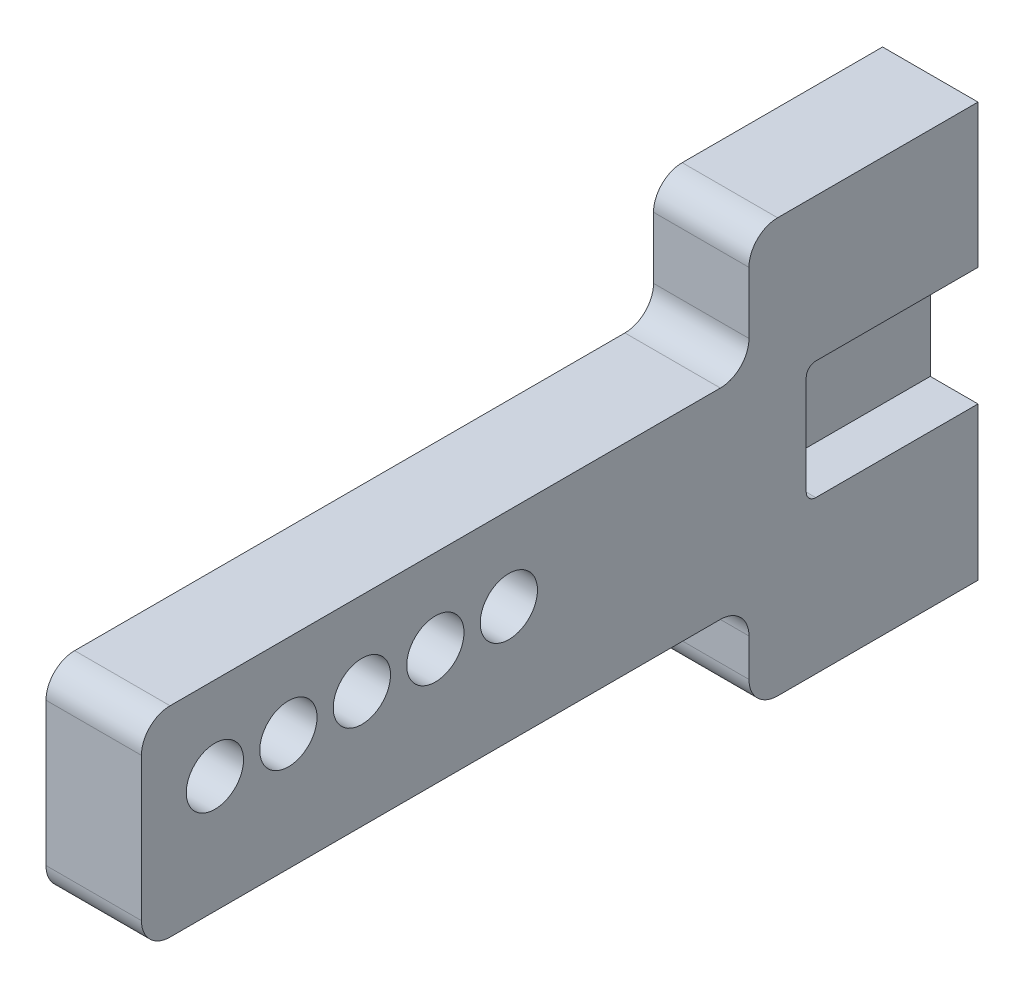
ISO-10303-21;
HEADER;
FILE_DESCRIPTION(('STEP AP214'),'2;1');
FILE_NAME('part.step','',(''),(''),'','','');
FILE_SCHEMA(('AUTOMOTIVE_DESIGN { 1 0 10303 214 1 1 1 1 }'));
ENDSEC;
DATA;
#1=APPLICATION_CONTEXT('core data for automotive mechanical design processes');
#2=APPLICATION_PROTOCOL_DEFINITION('international standard','automotive_design',2000,#1);
#3=PRODUCT_CONTEXT('',#1,'mechanical');
#4=PRODUCT('Part','Part','',(#3));
#5=PRODUCT_RELATED_PRODUCT_CATEGORY('part','',(#4));
#6=PRODUCT_DEFINITION_FORMATION('','',#4);
#7=PRODUCT_DEFINITION_CONTEXT('part definition',#1,'design');
#8=PRODUCT_DEFINITION('design','',#6,#7);
#9=PRODUCT_DEFINITION_SHAPE('','',#8);
#10=(LENGTH_UNIT() NAMED_UNIT(*) SI_UNIT(.MILLI.,.METRE.));
#11=(NAMED_UNIT(*) PLANE_ANGLE_UNIT() SI_UNIT($,.RADIAN.));
#12=(NAMED_UNIT(*) SI_UNIT($,.STERADIAN.) SOLID_ANGLE_UNIT());
#13=UNCERTAINTY_MEASURE_WITH_UNIT(LENGTH_MEASURE(1.E-05),#10,'distance_accuracy_value','');
#14=(GEOMETRIC_REPRESENTATION_CONTEXT(3) GLOBAL_UNCERTAINTY_ASSIGNED_CONTEXT((#13)) GLOBAL_UNIT_ASSIGNED_CONTEXT((#10,
#11,#12)) REPRESENTATION_CONTEXT('',''));
#15=CARTESIAN_POINT('',(0.,0.,0.));
#16=DIRECTION('',(0.,0.,1.));
#17=DIRECTION('',(1.,0.,0.));
#18=AXIS2_PLACEMENT_3D('',#15,#16,#17);
#19=CARTESIAN_POINT('',(10.,-10.2165086349905,0.));
#20=DIRECTION('',(0.,0.,1.));
#21=DIRECTION('',(1.,0.,0.));
#22=AXIS2_PLACEMENT_3D('',#19,#20,#21);
#23=PLANE('',#22);
#24=DIRECTION('',(0.,1.,0.));
#25=VECTOR('',#24,1.);
#26=CARTESIAN_POINT('',(5.,12.394708994709,0.));
#27=LINE('',#26,#25);
#28=CARTESIAN_POINT('',(5.,0.,0.));
#29=VERTEX_POINT('',#28);
#30=CARTESIAN_POINT('',(5.,12.394708994709,0.));
#31=VERTEX_POINT('',#30);
#32=EDGE_CURVE('E190',#29,#31,#27,.T.);
#33=ORIENTED_EDGE('',*,*,#32,.F.);
#34=DIRECTION('',(1.,0.,0.));
#35=VECTOR('',#34,1.);
#36=CARTESIAN_POINT('',(5.,0.,0.));
#37=LINE('',#36,#35);
#38=CARTESIAN_POINT('',(10.,0.,0.));
#39=VERTEX_POINT('',#38);
#40=EDGE_CURVE('E207',#29,#39,#37,.T.);
#41=ORIENTED_EDGE('',*,*,#40,.T.);
#42=DIRECTION('',(0.,1.,0.));
#43=VECTOR('',#42,1.);
#44=CARTESIAN_POINT('',(10.,-16.0028498087904,0.));
#45=LINE('',#44,#43);
#46=CARTESIAN_POINT('',(10.,-16.0028498087904,0.));
#47=VERTEX_POINT('',#46);
#48=EDGE_CURVE('E216',#47,#39,#45,.T.);
#49=ORIENTED_EDGE('',*,*,#48,.F.);
#50=DIRECTION('',(-1.,0.,0.));
#51=VECTOR('',#50,1.);
#52=CARTESIAN_POINT('',(10.,-16.0028498087904,0.));
#53=LINE('',#52,#51);
#54=CARTESIAN_POINT('',(0.,-16.0028498087904,0.));
#55=VERTEX_POINT('',#54);
#56=EDGE_CURVE('E245',#47,#55,#53,.T.);
#57=ORIENTED_EDGE('',*,*,#56,.T.);
#58=DIRECTION('',(0.,1.,0.));
#59=VECTOR('',#58,1.);
#60=CARTESIAN_POINT('',(0.,-10.2165086349905,0.));
#61=LINE('',#60,#59);
#62=CARTESIAN_POINT('',(0.,27.394708994709,0.));
#63=VERTEX_POINT('',#62);
#64=EDGE_CURVE('E211',#55,#63,#61,.T.);
#65=ORIENTED_EDGE('',*,*,#64,.T.);
#66=DIRECTION('',(-1.,0.,0.));
#67=VECTOR('',#66,1.);
#68=CARTESIAN_POINT('',(10.,27.394708994709,0.));
#69=LINE('',#68,#67);
#70=CARTESIAN_POINT('',(10.,27.394708994709,0.));
#71=VERTEX_POINT('',#70);
#72=EDGE_CURVE('E276',#71,#63,#69,.T.);
#73=ORIENTED_EDGE('',*,*,#72,.F.);
#74=CARTESIAN_POINT('',(10.,12.394708994709,0.));
#75=VERTEX_POINT('',#74);
#76=EDGE_CURVE('E205',#75,#71,#45,.T.);
#77=ORIENTED_EDGE('',*,*,#76,.F.);
#78=DIRECTION('',(1.,0.,0.));
#79=VECTOR('',#78,1.);
#80=CARTESIAN_POINT('',(5.,12.394708994709,0.));
#81=LINE('',#80,#79);
#82=EDGE_CURVE('E185',#31,#75,#81,.T.);
#83=ORIENTED_EDGE('',*,*,#82,.F.);
#84=EDGE_LOOP('',(#33,#41,#49,#57,#65,#73,#77,#83));
#85=FACE_BOUND('',#84,.T.);
#86=ADVANCED_FACE('F45',(#85),#23,.F.);
#87=CARTESIAN_POINT('',(10.,27.394708994709,0.));
#88=DIRECTION('',(0.,-1.,0.));
#89=DIRECTION('',(0.,0.,-1.));
#90=AXIS2_PLACEMENT_3D('',#87,#88,#89);
#91=PLANE('',#90);
#92=DIRECTION('',(0.,0.,1.));
#93=VECTOR('',#92,1.);
#94=CARTESIAN_POINT('',(0.,27.394708994709,0.));
#95=LINE('',#94,#93);
#96=CARTESIAN_POINT('',(0.,27.394708994709,21.));
#97=VERTEX_POINT('',#96);
#98=EDGE_CURVE('E248',#63,#97,#95,.T.);
#99=ORIENTED_EDGE('',*,*,#98,.T.);
#100=DIRECTION('',(-1.,0.,0.));
#101=VECTOR('',#100,1.);
#102=CARTESIAN_POINT('',(10.,27.394708994709,21.));
#103=LINE('',#102,#101);
#104=CARTESIAN_POINT('',(10.,27.394708994709,21.));
#105=VERTEX_POINT('',#104);
#106=EDGE_CURVE('E345',#97,#105,#103,.F.);
#107=ORIENTED_EDGE('',*,*,#106,.T.);
#108=DIRECTION('',(0.,0.,1.));
#109=VECTOR('',#108,1.);
#110=CARTESIAN_POINT('',(10.,27.394708994709,0.));
#111=LINE('',#110,#109);
#112=EDGE_CURVE('E220',#71,#105,#111,.T.);
#113=ORIENTED_EDGE('',*,*,#112,.F.);
#114=ORIENTED_EDGE('',*,*,#72,.T.);
#115=EDGE_LOOP('',(#99,#107,#113,#114));
#116=FACE_BOUND('',#115,.T.);
#117=ADVANCED_FACE('F431',(#116),#91,.F.);
#118=CARTESIAN_POINT('',(10.,27.394708994709,24.));
#119=DIRECTION('',(0.,0.,-1.));
#120=DIRECTION('',(0.,1.,0.));
#121=AXIS2_PLACEMENT_3D('',#118,#119,#120);
#122=PLANE('',#121);
#123=DIRECTION('',(0.,-1.,0.));
#124=VECTOR('',#123,1.);
#125=CARTESIAN_POINT('',(10.,27.394708994709,24.));
#126=LINE('',#125,#124);
#127=CARTESIAN_POINT('',(10.,24.394708994709,24.));
#128=VERTEX_POINT('',#127);
#129=CARTESIAN_POINT('',(10.,17.9424240836782,24.));
#130=VERTEX_POINT('',#129);
#131=EDGE_CURVE('E224',#128,#130,#126,.T.);
#132=ORIENTED_EDGE('',*,*,#131,.F.);
#133=DIRECTION('',(-1.,0.,0.));
#134=VECTOR('',#133,1.);
#135=CARTESIAN_POINT('',(10.,24.394708994709,24.));
#136=LINE('',#135,#134);
#137=CARTESIAN_POINT('',(0.,24.394708994709,24.));
#138=VERTEX_POINT('',#137);
#139=EDGE_CURVE('E341',#128,#138,#136,.T.);
#140=ORIENTED_EDGE('',*,*,#139,.T.);
#141=DIRECTION('',(0.,-1.,0.));
#142=VECTOR('',#141,1.);
#143=CARTESIAN_POINT('',(0.,27.394708994709,24.));
#144=LINE('',#143,#142);
#145=CARTESIAN_POINT('',(0.,17.9424240836782,24.));
#146=VERTEX_POINT('',#145);
#147=EDGE_CURVE('E252',#138,#146,#144,.T.);
#148=ORIENTED_EDGE('',*,*,#147,.T.);
#149=DIRECTION('',(-1.,0.,0.));
#150=VECTOR('',#149,1.);
#151=CARTESIAN_POINT('',(10.,17.9424240836782,24.));
#152=LINE('',#151,#150);
#153=EDGE_CURVE('E292',#146,#130,#152,.F.);
#154=ORIENTED_EDGE('',*,*,#153,.T.);
#155=EDGE_LOOP('',(#132,#140,#148,#154));
#156=FACE_BOUND('',#155,.T.);
#157=ADVANCED_FACE('F441',(#156),#122,.F.);
#158=CARTESIAN_POINT('',(10.,14.9424240836782,24.));
#159=DIRECTION('',(0.,-1.,0.));
#160=DIRECTION('',(0.,0.,-1.));
#161=AXIS2_PLACEMENT_3D('',#158,#159,#160);
#162=PLANE('',#161);
#163=DIRECTION('',(0.,0.,1.));
#164=VECTOR('',#163,1.);
#165=CARTESIAN_POINT('',(0.,14.9424240836782,24.));
#166=LINE('',#165,#164);
#167=CARTESIAN_POINT('',(0.,14.9424240836782,27.));
#168=VERTEX_POINT('',#167);
#169=CARTESIAN_POINT('',(0.,14.9424240836782,84.6638189462944));
#170=VERTEX_POINT('',#169);
#171=EDGE_CURVE('E255',#168,#170,#166,.T.);
#172=ORIENTED_EDGE('',*,*,#171,.T.);
#173=DIRECTION('',(-1.,0.,0.));
#174=VECTOR('',#173,1.);
#175=CARTESIAN_POINT('',(10.,14.9424240836782,84.6638189462944));
#176=LINE('',#175,#174);
#177=CARTESIAN_POINT('',(10.,14.9424240836782,84.6638189462944));
#178=VERTEX_POINT('',#177);
#179=EDGE_CURVE('E359',#170,#178,#176,.F.);
#180=ORIENTED_EDGE('',*,*,#179,.T.);
#181=DIRECTION('',(0.,0.,1.));
#182=VECTOR('',#181,1.);
#183=CARTESIAN_POINT('',(10.,14.9424240836782,24.));
#184=LINE('',#183,#182);
#185=CARTESIAN_POINT('',(10.,14.9424240836782,27.));
#186=VERTEX_POINT('',#185);
#187=EDGE_CURVE('E227',#186,#178,#184,.T.);
#188=ORIENTED_EDGE('',*,*,#187,.F.);
#189=DIRECTION('',(-1.,0.,0.));
#190=VECTOR('',#189,1.);
#191=CARTESIAN_POINT('',(0.,14.9424240836782,27.));
#192=LINE('',#191,#190);
#193=EDGE_CURVE('E288',#186,#168,#192,.T.);
#194=ORIENTED_EDGE('',*,*,#193,.T.);
#195=EDGE_LOOP('',(#172,#180,#188,#194));
#196=FACE_BOUND('',#195,.T.);
#197=ADVANCED_FACE('F450',(#196),#162,.F.);
#198=CARTESIAN_POINT('',(10.,14.9424240836782,87.6638189462944));
#199=DIRECTION('',(0.,0.,-1.));
#200=DIRECTION('',(-1.,0.,0.));
#201=AXIS2_PLACEMENT_3D('',#198,#199,#200);
#202=PLANE('',#201);
#203=DIRECTION('',(0.,-1.,0.));
#204=VECTOR('',#203,1.);
#205=CARTESIAN_POINT('',(0.,14.9424240836782,87.6638189462944));
#206=LINE('',#205,#204);
#207=CARTESIAN_POINT('',(0.,11.9424240836782,87.6638189462944));
#208=VERTEX_POINT('',#207);
#209=CARTESIAN_POINT('',(0.,-3.05757591632179,87.6638189462944));
#210=VERTEX_POINT('',#209);
#211=EDGE_CURVE('E259',#208,#210,#206,.T.);
#212=ORIENTED_EDGE('',*,*,#211,.T.);
#213=DIRECTION('',(-1.,0.,0.));
#214=VECTOR('',#213,1.);
#215=CARTESIAN_POINT('',(10.,-3.05757591632179,87.6638189462944));
#216=LINE('',#215,#214);
#217=CARTESIAN_POINT('',(10.,-3.05757591632179,87.6638189462944));
#218=VERTEX_POINT('',#217);
#219=EDGE_CURVE('E356',#210,#218,#216,.F.);
#220=ORIENTED_EDGE('',*,*,#219,.T.);
#221=DIRECTION('',(0.,-1.,0.));
#222=VECTOR('',#221,1.);
#223=CARTESIAN_POINT('',(10.,14.9424240836782,87.6638189462944));
#224=LINE('',#223,#222);
#225=CARTESIAN_POINT('',(10.,11.9424240836782,87.6638189462944));
#226=VERTEX_POINT('',#225);
#227=EDGE_CURVE('E231',#226,#218,#224,.T.);
#228=ORIENTED_EDGE('',*,*,#227,.F.);
#229=DIRECTION('',(-1.,0.,0.));
#230=VECTOR('',#229,1.);
#231=CARTESIAN_POINT('',(10.,11.9424240836782,87.6638189462944));
#232=LINE('',#231,#230);
#233=EDGE_CURVE('E352',#226,#208,#232,.T.);
#234=ORIENTED_EDGE('',*,*,#233,.T.);
#235=EDGE_LOOP('',(#212,#220,#228,#234));
#236=FACE_BOUND('',#235,.T.);
#237=ADVANCED_FACE('F461',(#236),#202,.F.);
#238=CARTESIAN_POINT('',(10.,-6.0575759163218,87.6638189462944));
#239=DIRECTION('',(0.,1.,0.));
#240=DIRECTION('',(0.,0.,1.));
#241=AXIS2_PLACEMENT_3D('',#238,#239,#240);
#242=PLANE('',#241);
#243=DIRECTION('',(0.,0.,-1.));
#244=VECTOR('',#243,1.);
#245=CARTESIAN_POINT('',(10.,-6.0575759163218,87.6638189462944));
#246=LINE('',#245,#244);
#247=CARTESIAN_POINT('',(10.,-6.0575759163218,84.6638189462944));
#248=VERTEX_POINT('',#247);
#249=CARTESIAN_POINT('',(10.,-6.0575759163218,27.));
#250=VERTEX_POINT('',#249);
#251=EDGE_CURVE('E235',#248,#250,#246,.T.);
#252=ORIENTED_EDGE('',*,*,#251,.F.);
#253=DIRECTION('',(-1.,0.,0.));
#254=VECTOR('',#253,1.);
#255=CARTESIAN_POINT('',(10.,-6.0575759163218,84.6638189462944));
#256=LINE('',#255,#254);
#257=CARTESIAN_POINT('',(0.,-6.0575759163218,84.6638189462944));
#258=VERTEX_POINT('',#257);
#259=EDGE_CURVE('E348',#248,#258,#256,.T.);
#260=ORIENTED_EDGE('',*,*,#259,.T.);
#261=DIRECTION('',(0.,0.,-1.));
#262=VECTOR('',#261,1.);
#263=CARTESIAN_POINT('',(0.,-6.0575759163218,87.6638189462944));
#264=LINE('',#263,#262);
#265=CARTESIAN_POINT('',(0.,-6.0575759163218,27.));
#266=VERTEX_POINT('',#265);
#267=EDGE_CURVE('E263',#258,#266,#264,.T.);
#268=ORIENTED_EDGE('',*,*,#267,.T.);
#269=DIRECTION('',(-1.,0.,0.));
#270=VECTOR('',#269,1.);
#271=CARTESIAN_POINT('',(10.,-6.0575759163218,27.));
#272=LINE('',#271,#270);
#273=EDGE_CURVE('E284',#266,#250,#272,.F.);
#274=ORIENTED_EDGE('',*,*,#273,.T.);
#275=EDGE_LOOP('',(#252,#260,#268,#274));
#276=FACE_BOUND('',#275,.T.);
#277=ADVANCED_FACE('F468',(#276),#242,.F.);
#278=CARTESIAN_POINT('',(10.,-6.0575759163218,24.));
#279=DIRECTION('',(0.,0.,-1.));
#280=DIRECTION('',(0.,1.,0.));
#281=AXIS2_PLACEMENT_3D('',#278,#279,#280);
#282=PLANE('',#281);
#283=DIRECTION('',(0.,-1.,0.));
#284=VECTOR('',#283,1.);
#285=CARTESIAN_POINT('',(0.,-6.0575759163218,24.));
#286=LINE('',#285,#284);
#287=CARTESIAN_POINT('',(0.,-9.05757591632179,24.));
#288=VERTEX_POINT('',#287);
#289=CARTESIAN_POINT('',(0.,-13.0028498087904,24.));
#290=VERTEX_POINT('',#289);
#291=EDGE_CURVE('E266',#288,#290,#286,.T.);
#292=ORIENTED_EDGE('',*,*,#291,.T.);
#293=DIRECTION('',(-1.,0.,0.));
#294=VECTOR('',#293,1.);
#295=CARTESIAN_POINT('',(10.,-13.0028498087904,24.));
#296=LINE('',#295,#294);
#297=CARTESIAN_POINT('',(10.,-13.0028498087904,24.));
#298=VERTEX_POINT('',#297);
#299=EDGE_CURVE('E326',#290,#298,#296,.F.);
#300=ORIENTED_EDGE('',*,*,#299,.T.);
#301=DIRECTION('',(0.,-1.,0.));
#302=VECTOR('',#301,1.);
#303=CARTESIAN_POINT('',(10.,-6.0575759163218,24.));
#304=LINE('',#303,#302);
#305=CARTESIAN_POINT('',(10.,-9.05757591632179,24.));
#306=VERTEX_POINT('',#305);
#307=EDGE_CURVE('E238',#306,#298,#304,.T.);
#308=ORIENTED_EDGE('',*,*,#307,.F.);
#309=DIRECTION('',(-1.,0.,0.));
#310=VECTOR('',#309,1.);
#311=CARTESIAN_POINT('',(0.,-9.05757591632179,24.));
#312=LINE('',#311,#310);
#313=EDGE_CURVE('E280',#306,#288,#312,.T.);
#314=ORIENTED_EDGE('',*,*,#313,.T.);
#315=EDGE_LOOP('',(#292,#300,#308,#314));
#316=FACE_BOUND('',#315,.T.);
#317=ADVANCED_FACE('F477',(#316),#282,.F.);
#318=CARTESIAN_POINT('',(10.,-16.0028498087904,24.));
#319=DIRECTION('',(0.,1.,0.));
#320=DIRECTION('',(0.,0.,1.));
#321=AXIS2_PLACEMENT_3D('',#318,#319,#320);
#322=PLANE('',#321);
#323=DIRECTION('',(0.,0.,-1.));
#324=VECTOR('',#323,1.);
#325=CARTESIAN_POINT('',(10.,-16.0028498087904,24.));
#326=LINE('',#325,#324);
#327=CARTESIAN_POINT('',(10.,-16.0028498087904,21.));
#328=VERTEX_POINT('',#327);
#329=EDGE_CURVE('E242',#328,#47,#326,.T.);
#330=ORIENTED_EDGE('',*,*,#329,.F.);
#331=DIRECTION('',(-1.,0.,0.));
#332=VECTOR('',#331,1.);
#333=CARTESIAN_POINT('',(10.,-16.0028498087904,21.));
#334=LINE('',#333,#332);
#335=CARTESIAN_POINT('',(0.,-16.0028498087904,21.));
#336=VERTEX_POINT('',#335);
#337=EDGE_CURVE('E310',#328,#336,#334,.T.);
#338=ORIENTED_EDGE('',*,*,#337,.T.);
#339=DIRECTION('',(0.,0.,-1.));
#340=VECTOR('',#339,1.);
#341=CARTESIAN_POINT('',(0.,-16.0028498087904,24.));
#342=LINE('',#341,#340);
#343=EDGE_CURVE('E270',#336,#55,#342,.T.);
#344=ORIENTED_EDGE('',*,*,#343,.T.);
#345=ORIENTED_EDGE('',*,*,#56,.F.);
#346=EDGE_LOOP('',(#330,#338,#344,#345));
#347=FACE_BOUND('',#346,.T.);
#348=ADVANCED_FACE('F424',(#347),#322,.F.);
#349=CARTESIAN_POINT('',(10.,0.,0.));
#350=DIRECTION('',(1.,0.,0.));
#351=DIRECTION('',(0.,0.,-1.));
#352=AXIS2_PLACEMENT_3D('',#349,#350,#351);
#353=PLANE('',#352);
#354=CARTESIAN_POINT('',(10.,6.19735449735449,79.9638189462944));
#355=DIRECTION('',(1.,0.,0.));
#356=DIRECTION('',(0.,0.,-1.));
#357=AXIS2_PLACEMENT_3D('',#354,#355,#356);
#358=CIRCLE('',#357,3.00000000000001);
#359=CARTESIAN_POINT('',(10.,6.19735449735449,76.9638189462944));
#360=VERTEX_POINT('',#359);
#361=EDGE_CURVE('E388',#360,#360,#358,.T.);
#362=ORIENTED_EDGE('',*,*,#361,.F.);
#363=EDGE_LOOP('',(#362));
#364=FACE_BOUND('',#363,.T.);
#365=CARTESIAN_POINT('',(10.,6.19735449735449,72.2638189462944));
#366=DIRECTION('',(1.,0.,0.));
#367=DIRECTION('',(0.,0.,-1.));
#368=AXIS2_PLACEMENT_3D('',#365,#366,#367);
#369=CIRCLE('',#368,3.00000000000001);
#370=CARTESIAN_POINT('',(10.,6.19735449735449,69.2638189462944));
#371=VERTEX_POINT('',#370);
#372=EDGE_CURVE('E703',#371,#371,#369,.T.);
#373=ORIENTED_EDGE('',*,*,#372,.F.);
#374=EDGE_LOOP('',(#373));
#375=FACE_BOUND('',#374,.T.);
#376=CARTESIAN_POINT('',(10.,6.19735449735449,64.5638189462944));
#377=DIRECTION('',(1.,0.,0.));
#378=DIRECTION('',(0.,0.,-1.));
#379=AXIS2_PLACEMENT_3D('',#376,#377,#378);
#380=CIRCLE('',#379,3.);
#381=CARTESIAN_POINT('',(10.,6.19735449735449,61.5638189462944));
#382=VERTEX_POINT('',#381);
#383=EDGE_CURVE('E707',#382,#382,#380,.T.);
#384=ORIENTED_EDGE('',*,*,#383,.F.);
#385=EDGE_LOOP('',(#384));
#386=FACE_BOUND('',#385,.T.);
#387=CARTESIAN_POINT('',(10.,6.19735449735449,56.8638189462944));
#388=DIRECTION('',(1.,0.,0.));
#389=DIRECTION('',(0.,0.,-1.));
#390=AXIS2_PLACEMENT_3D('',#387,#388,#389);
#391=CIRCLE('',#390,3.);
#392=CARTESIAN_POINT('',(10.,6.19735449735449,53.8638189462944));
#393=VERTEX_POINT('',#392);
#394=EDGE_CURVE('E713',#393,#393,#391,.T.);
#395=ORIENTED_EDGE('',*,*,#394,.F.);
#396=EDGE_LOOP('',(#395));
#397=FACE_BOUND('',#396,.T.);
#398=CARTESIAN_POINT('',(10.,6.19735449735449,49.1638189462944));
#399=DIRECTION('',(1.,0.,0.));
#400=DIRECTION('',(0.,0.,-1.));
#401=AXIS2_PLACEMENT_3D('',#398,#399,#400);
#402=CIRCLE('',#401,3.);
#403=CARTESIAN_POINT('',(10.,6.19735449735449,46.1638189462944));
#404=VERTEX_POINT('',#403);
#405=EDGE_CURVE('E717',#404,#404,#402,.T.);
#406=ORIENTED_EDGE('',*,*,#405,.F.);
#407=EDGE_LOOP('',(#406));
#408=FACE_BOUND('',#407,.T.);
#409=ORIENTED_EDGE('',*,*,#307,.T.);
#410=CARTESIAN_POINT('',(10.,-13.0028498087904,21.));
#411=DIRECTION('',(1.,0.,0.));
#412=DIRECTION('',(0.,0.,-1.));
#413=AXIS2_PLACEMENT_3D('',#410,#411,#412);
#414=CIRCLE('',#413,3.);
#415=EDGE_CURVE('E338',#298,#328,#414,.T.);
#416=ORIENTED_EDGE('',*,*,#415,.T.);
#417=ORIENTED_EDGE('',*,*,#329,.T.);
#418=ORIENTED_EDGE('',*,*,#48,.T.);
#419=DIRECTION('',(0.,0.,-1.));
#420=VECTOR('',#419,1.);
#421=CARTESIAN_POINT('',(10.,0.,0.));
#422=LINE('',#421,#420);
#423=CARTESIAN_POINT('',(10.,0.,17.));
#424=VERTEX_POINT('',#423);
#425=EDGE_CURVE('E201',#424,#39,#422,.T.);
#426=ORIENTED_EDGE('',*,*,#425,.F.);
#427=CARTESIAN_POINT('',(10.,0.999999999999998,17.));
#428=DIRECTION('',(1.,0.,0.));
#429=DIRECTION('',(0.,0.,-1.));
#430=AXIS2_PLACEMENT_3D('',#427,#428,#429);
#431=CIRCLE('',#430,1.);
#432=CARTESIAN_POINT('',(10.,0.999999999999997,18.));
#433=VERTEX_POINT('',#432);
#434=EDGE_CURVE('E55',#424,#433,#431,.F.);
#435=ORIENTED_EDGE('',*,*,#434,.T.);
#436=DIRECTION('',(0.,-1.,0.));
#437=VECTOR('',#436,1.);
#438=CARTESIAN_POINT('',(10.,0.,18.));
#439=LINE('',#438,#437);
#440=CARTESIAN_POINT('',(10.,11.394708994709,18.));
#441=VERTEX_POINT('',#440);
#442=EDGE_CURVE('E406',#441,#433,#439,.T.);
#443=ORIENTED_EDGE('',*,*,#442,.F.);
#444=CARTESIAN_POINT('',(10.,11.394708994709,17.));
#445=DIRECTION('',(1.,0.,0.));
#446=DIRECTION('',(0.,0.,-1.));
#447=AXIS2_PLACEMENT_3D('',#444,#445,#446);
#448=CIRCLE('',#447,1.);
#449=CARTESIAN_POINT('',(10.,12.394708994709,17.));
#450=VERTEX_POINT('',#449);
#451=EDGE_CURVE('E11',#441,#450,#448,.F.);
#452=ORIENTED_EDGE('',*,*,#451,.T.);
#453=DIRECTION('',(0.,0.,1.));
#454=VECTOR('',#453,1.);
#455=CARTESIAN_POINT('',(10.,12.394708994709,18.));
#456=LINE('',#455,#454);
#457=EDGE_CURVE('E402',#75,#450,#456,.T.);
#458=ORIENTED_EDGE('',*,*,#457,.F.);
#459=ORIENTED_EDGE('',*,*,#76,.T.);
#460=ORIENTED_EDGE('',*,*,#112,.T.);
#461=CARTESIAN_POINT('',(10.,24.394708994709,21.));
#462=DIRECTION('',(1.,0.,0.));
#463=DIRECTION('',(0.,0.,-1.));
#464=AXIS2_PLACEMENT_3D('',#461,#462,#463);
#465=CIRCLE('',#464,3.);
#466=EDGE_CURVE('E335',#105,#128,#465,.T.);
#467=ORIENTED_EDGE('',*,*,#466,.T.);
#468=ORIENTED_EDGE('',*,*,#131,.T.);
#469=CARTESIAN_POINT('',(10.,17.9424240836782,27.));
#470=DIRECTION('',(1.,0.,0.));
#471=DIRECTION('',(0.,0.,-1.));
#472=AXIS2_PLACEMENT_3D('',#469,#470,#471);
#473=CIRCLE('',#472,3.);
#474=EDGE_CURVE('E307',#130,#186,#473,.F.);
#475=ORIENTED_EDGE('',*,*,#474,.T.);
#476=ORIENTED_EDGE('',*,*,#187,.T.);
#477=CARTESIAN_POINT('',(10.,11.9424240836782,84.6638189462944));
#478=DIRECTION('',(1.,0.,0.));
#479=DIRECTION('',(0.,0.,-1.));
#480=AXIS2_PLACEMENT_3D('',#477,#478,#479);
#481=CIRCLE('',#480,3.);
#482=EDGE_CURVE('E329',#178,#226,#481,.T.);
#483=ORIENTED_EDGE('',*,*,#482,.T.);
#484=ORIENTED_EDGE('',*,*,#227,.T.);
#485=CARTESIAN_POINT('',(10.,-3.0575759163218,84.6638189462944));
#486=DIRECTION('',(1.,0.,0.));
#487=DIRECTION('',(0.,0.,-1.));
#488=AXIS2_PLACEMENT_3D('',#485,#486,#487);
#489=CIRCLE('',#488,3.);
#490=EDGE_CURVE('E332',#218,#248,#489,.T.);
#491=ORIENTED_EDGE('',*,*,#490,.T.);
#492=ORIENTED_EDGE('',*,*,#251,.T.);
#493=CARTESIAN_POINT('',(10.,-9.0575759163218,27.));
#494=DIRECTION('',(1.,0.,0.));
#495=DIRECTION('',(0.,0.,-1.));
#496=AXIS2_PLACEMENT_3D('',#493,#494,#495);
#497=CIRCLE('',#496,3.);
#498=EDGE_CURVE('E300',#250,#306,#497,.F.);
#499=ORIENTED_EDGE('',*,*,#498,.T.);
#500=EDGE_LOOP('',(#409,#416,#417,#418,#426,#435,#443,#452,#458,#459,#460,#467,#468,#475,#476,
#483,#484,#491,#492,#499));
#501=FACE_BOUND('',#500,.T.);
#502=ADVANCED_FACE('F418',(#364,#375,#386,#397,#408,#501),#353,.T.);
#503=CARTESIAN_POINT('',(0.,0.,0.));
#504=DIRECTION('',(1.,0.,0.));
#505=DIRECTION('',(0.,0.,-1.));
#506=AXIS2_PLACEMENT_3D('',#503,#504,#505);
#507=PLANE('',#506);
#508=CARTESIAN_POINT('',(0.,6.19735449735449,79.9638189462944));
#509=DIRECTION('',(1.,0.,0.));
#510=DIRECTION('',(0.,0.,-1.));
#511=AXIS2_PLACEMENT_3D('',#508,#509,#510);
#512=CIRCLE('',#511,3.00000000000001);
#513=CARTESIAN_POINT('',(0.,6.19735449735449,76.9638189462944));
#514=VERTEX_POINT('',#513);
#515=EDGE_CURVE('E49',#514,#514,#512,.T.);
#516=ORIENTED_EDGE('',*,*,#515,.T.);
#517=EDGE_LOOP('',(#516));
#518=FACE_BOUND('',#517,.T.);
#519=CARTESIAN_POINT('',(0.,6.19735449735449,72.2638189462944));
#520=DIRECTION('',(1.,0.,0.));
#521=DIRECTION('',(0.,0.,-1.));
#522=AXIS2_PLACEMENT_3D('',#519,#520,#521);
#523=CIRCLE('',#522,3.00000000000001);
#524=CARTESIAN_POINT('',(0.,6.19735449735449,69.2638189462944));
#525=VERTEX_POINT('',#524);
#526=EDGE_CURVE('E395',#525,#525,#523,.T.);
#527=ORIENTED_EDGE('',*,*,#526,.T.);
#528=EDGE_LOOP('',(#527));
#529=FACE_BOUND('',#528,.T.);
#530=CARTESIAN_POINT('',(0.,6.19735449735449,64.5638189462944));
#531=DIRECTION('',(1.,0.,0.));
#532=DIRECTION('',(0.,0.,-1.));
#533=AXIS2_PLACEMENT_3D('',#530,#531,#532);
#534=CIRCLE('',#533,3.);
#535=CARTESIAN_POINT('',(0.,6.19735449735449,61.5638189462944));
#536=VERTEX_POINT('',#535);
#537=EDGE_CURVE('E392',#536,#536,#534,.T.);
#538=ORIENTED_EDGE('',*,*,#537,.T.);
#539=EDGE_LOOP('',(#538));
#540=FACE_BOUND('',#539,.T.);
#541=CARTESIAN_POINT('',(0.,6.19735449735449,56.8638189462944));
#542=DIRECTION('',(1.,0.,0.));
#543=DIRECTION('',(0.,0.,-1.));
#544=AXIS2_PLACEMENT_3D('',#541,#542,#543);
#545=CIRCLE('',#544,3.);
#546=CARTESIAN_POINT('',(0.,6.19735449735449,53.8638189462944));
#547=VERTEX_POINT('',#546);
#548=EDGE_CURVE('E387',#547,#547,#545,.T.);
#549=ORIENTED_EDGE('',*,*,#548,.T.);
#550=EDGE_LOOP('',(#549));
#551=FACE_BOUND('',#550,.T.);
#552=CARTESIAN_POINT('',(0.,6.19735449735449,49.1638189462944));
#553=DIRECTION('',(1.,0.,0.));
#554=DIRECTION('',(0.,0.,-1.));
#555=AXIS2_PLACEMENT_3D('',#552,#553,#554);
#556=CIRCLE('',#555,3.);
#557=CARTESIAN_POINT('',(0.,6.19735449735449,46.1638189462944));
#558=VERTEX_POINT('',#557);
#559=EDGE_CURVE('E383',#558,#558,#556,.T.);
#560=ORIENTED_EDGE('',*,*,#559,.T.);
#561=EDGE_LOOP('',(#560));
#562=FACE_BOUND('',#561,.T.);
#563=ORIENTED_EDGE('',*,*,#343,.F.);
#564=CARTESIAN_POINT('',(0.,-13.0028498087904,21.));
#565=DIRECTION('',(1.,0.,0.));
#566=DIRECTION('',(0.,0.,-1.));
#567=AXIS2_PLACEMENT_3D('',#564,#565,#566);
#568=CIRCLE('',#567,3.);
#569=EDGE_CURVE('E323',#336,#290,#568,.F.);
#570=ORIENTED_EDGE('',*,*,#569,.T.);
#571=ORIENTED_EDGE('',*,*,#291,.F.);
#572=CARTESIAN_POINT('',(0.,-9.0575759163218,27.));
#573=DIRECTION('',(1.,0.,0.));
#574=DIRECTION('',(0.,0.,-1.));
#575=AXIS2_PLACEMENT_3D('',#572,#573,#574);
#576=CIRCLE('',#575,3.);
#577=EDGE_CURVE('E296',#288,#266,#576,.T.);
#578=ORIENTED_EDGE('',*,*,#577,.T.);
#579=ORIENTED_EDGE('',*,*,#267,.F.);
#580=CARTESIAN_POINT('',(0.,-3.0575759163218,84.6638189462944));
#581=DIRECTION('',(1.,0.,0.));
#582=DIRECTION('',(0.,0.,-1.));
#583=AXIS2_PLACEMENT_3D('',#580,#581,#582);
#584=CIRCLE('',#583,3.);
#585=EDGE_CURVE('E317',#258,#210,#584,.F.);
#586=ORIENTED_EDGE('',*,*,#585,.T.);
#587=ORIENTED_EDGE('',*,*,#211,.F.);
#588=CARTESIAN_POINT('',(0.,11.9424240836782,84.6638189462944));
#589=DIRECTION('',(1.,0.,0.));
#590=DIRECTION('',(0.,0.,-1.));
#591=AXIS2_PLACEMENT_3D('',#588,#589,#590);
#592=CIRCLE('',#591,3.);
#593=EDGE_CURVE('E314',#208,#170,#592,.F.);
#594=ORIENTED_EDGE('',*,*,#593,.T.);
#595=ORIENTED_EDGE('',*,*,#171,.F.);
#596=CARTESIAN_POINT('',(0.,17.9424240836782,27.));
#597=DIRECTION('',(1.,0.,0.));
#598=DIRECTION('',(0.,0.,-1.));
#599=AXIS2_PLACEMENT_3D('',#596,#597,#598);
#600=CIRCLE('',#599,3.);
#601=EDGE_CURVE('E303',#168,#146,#600,.T.);
#602=ORIENTED_EDGE('',*,*,#601,.T.);
#603=ORIENTED_EDGE('',*,*,#147,.F.);
#604=CARTESIAN_POINT('',(0.,24.394708994709,21.));
#605=DIRECTION('',(1.,0.,0.));
#606=DIRECTION('',(0.,0.,-1.));
#607=AXIS2_PLACEMENT_3D('',#604,#605,#606);
#608=CIRCLE('',#607,3.);
#609=EDGE_CURVE('E320',#138,#97,#608,.F.);
#610=ORIENTED_EDGE('',*,*,#609,.T.);
#611=ORIENTED_EDGE('',*,*,#98,.F.);
#612=ORIENTED_EDGE('',*,*,#64,.F.);
#613=EDGE_LOOP('',(#563,#570,#571,#578,#579,#586,#587,#594,#595,#602,#603,#610,#611,#612));
#614=FACE_BOUND('',#613,.T.);
#615=ADVANCED_FACE('F433',(#518,#529,#540,#551,#562,#614),#507,.F.);
#616=CARTESIAN_POINT('',(5.,0.,0.));
#617=DIRECTION('',(0.,-1.,0.));
#618=DIRECTION('',(0.,0.,-1.));
#619=AXIS2_PLACEMENT_3D('',#616,#617,#618);
#620=PLANE('',#619);
#621=DIRECTION('',(0.,0.,-1.));
#622=VECTOR('',#621,1.);
#623=CARTESIAN_POINT('',(5.,0.,0.));
#624=LINE('',#623,#622);
#625=CARTESIAN_POINT('',(5.,0.,17.));
#626=VERTEX_POINT('',#625);
#627=EDGE_CURVE('E196',#626,#29,#624,.T.);
#628=ORIENTED_EDGE('',*,*,#627,.F.);
#629=DIRECTION('',(1.,0.,0.));
#630=VECTOR('',#629,1.);
#631=CARTESIAN_POINT('',(10.,0.,17.));
#632=LINE('',#631,#630);
#633=EDGE_CURVE('E362',#626,#424,#632,.T.);
#634=ORIENTED_EDGE('',*,*,#633,.T.);
#635=ORIENTED_EDGE('',*,*,#425,.T.);
#636=ORIENTED_EDGE('',*,*,#40,.F.);
#637=EDGE_LOOP('',(#628,#634,#635,#636));
#638=FACE_BOUND('',#637,.T.);
#639=ADVANCED_FACE('F415',(#638),#620,.F.);
#640=CARTESIAN_POINT('',(5.,0.,18.));
#641=DIRECTION('',(0.,0.,1.));
#642=DIRECTION('',(1.,0.,0.));
#643=AXIS2_PLACEMENT_3D('',#640,#641,#642);
#644=PLANE('',#643);
#645=ORIENTED_EDGE('',*,*,#442,.T.);
#646=DIRECTION('',(1.,0.,0.));
#647=VECTOR('',#646,1.);
#648=CARTESIAN_POINT('',(5.,0.999999999999998,18.));
#649=LINE('',#648,#647);
#650=CARTESIAN_POINT('',(5.,0.999999999999997,18.));
#651=VERTEX_POINT('',#650);
#652=EDGE_CURVE('E370',#433,#651,#649,.F.);
#653=ORIENTED_EDGE('',*,*,#652,.T.);
#654=DIRECTION('',(0.,-1.,0.));
#655=VECTOR('',#654,1.);
#656=CARTESIAN_POINT('',(5.,0.,18.));
#657=LINE('',#656,#655);
#658=CARTESIAN_POINT('',(5.,11.394708994709,18.));
#659=VERTEX_POINT('',#658);
#660=EDGE_CURVE('E189',#659,#651,#657,.T.);
#661=ORIENTED_EDGE('',*,*,#660,.F.);
#662=DIRECTION('',(1.,0.,0.));
#663=VECTOR('',#662,1.);
#664=CARTESIAN_POINT('',(10.,11.394708994709,18.));
#665=LINE('',#664,#663);
#666=EDGE_CURVE('E366',#659,#441,#665,.T.);
#667=ORIENTED_EDGE('',*,*,#666,.T.);
#668=EDGE_LOOP('',(#645,#653,#661,#667));
#669=FACE_BOUND('',#668,.T.);
#670=ADVANCED_FACE('F508',(#669),#644,.F.);
#671=CARTESIAN_POINT('',(5.,12.394708994709,18.));
#672=DIRECTION('',(0.,1.,0.));
#673=DIRECTION('',(0.,0.,1.));
#674=AXIS2_PLACEMENT_3D('',#671,#672,#673);
#675=PLANE('',#674);
#676=ORIENTED_EDGE('',*,*,#457,.T.);
#677=DIRECTION('',(1.,0.,0.));
#678=VECTOR('',#677,1.);
#679=CARTESIAN_POINT('',(5.,12.394708994709,17.));
#680=LINE('',#679,#678);
#681=CARTESIAN_POINT('',(5.,12.394708994709,17.));
#682=VERTEX_POINT('',#681);
#683=EDGE_CURVE('E68',#450,#682,#680,.F.);
#684=ORIENTED_EDGE('',*,*,#683,.T.);
#685=DIRECTION('',(0.,0.,1.));
#686=VECTOR('',#685,1.);
#687=CARTESIAN_POINT('',(5.,12.394708994709,18.));
#688=LINE('',#687,#686);
#689=EDGE_CURVE('E181',#31,#682,#688,.T.);
#690=ORIENTED_EDGE('',*,*,#689,.F.);
#691=ORIENTED_EDGE('',*,*,#82,.T.);
#692=EDGE_LOOP('',(#676,#684,#690,#691));
#693=FACE_BOUND('',#692,.T.);
#694=ADVANCED_FACE('F183',(#693),#675,.F.);
#695=CARTESIAN_POINT('',(5.,0.,0.));
#696=DIRECTION('',(-1.,0.,0.));
#697=DIRECTION('',(0.,0.,1.));
#698=AXIS2_PLACEMENT_3D('',#695,#696,#697);
#699=PLANE('',#698);
#700=ORIENTED_EDGE('',*,*,#660,.T.);
#701=CARTESIAN_POINT('',(5.,0.999999999999998,17.));
#702=DIRECTION('',(-1.,0.,0.));
#703=DIRECTION('',(0.,0.,1.));
#704=AXIS2_PLACEMENT_3D('',#701,#702,#703);
#705=CIRCLE('',#704,1.);
#706=EDGE_CURVE('E376',#651,#626,#705,.F.);
#707=ORIENTED_EDGE('',*,*,#706,.T.);
#708=ORIENTED_EDGE('',*,*,#627,.T.);
#709=ORIENTED_EDGE('',*,*,#32,.T.);
#710=ORIENTED_EDGE('',*,*,#689,.T.);
#711=CARTESIAN_POINT('',(5.,11.394708994709,17.));
#712=DIRECTION('',(-1.,0.,0.));
#713=DIRECTION('',(0.,0.,1.));
#714=AXIS2_PLACEMENT_3D('',#711,#712,#713);
#715=CIRCLE('',#714,1.);
#716=EDGE_CURVE('E373',#682,#659,#715,.F.);
#717=ORIENTED_EDGE('',*,*,#716,.T.);
#718=EDGE_LOOP('',(#700,#707,#708,#709,#710,#717));
#719=FACE_BOUND('',#718,.T.);
#720=ADVANCED_FACE('F194',(#719),#699,.F.);
#721=CARTESIAN_POINT('',(10.,-9.0575759163218,27.));
#722=DIRECTION('',(1.,0.,0.));
#723=DIRECTION('',(0.,0.,-1.));
#724=AXIS2_PLACEMENT_3D('',#721,#722,#723);
#725=CYLINDRICAL_SURFACE('',#724,3.);
#726=ORIENTED_EDGE('',*,*,#498,.F.);
#727=ORIENTED_EDGE('',*,*,#273,.F.);
#728=ORIENTED_EDGE('',*,*,#577,.F.);
#729=ORIENTED_EDGE('',*,*,#313,.F.);
#730=EDGE_LOOP('',(#726,#727,#728,#729));
#731=FACE_BOUND('',#730,.T.);
#732=ADVANCED_FACE('F474',(#731),#725,.F.);
#733=CARTESIAN_POINT('',(10.,17.9424240836782,27.));
#734=DIRECTION('',(1.,0.,0.));
#735=DIRECTION('',(0.,0.,-1.));
#736=AXIS2_PLACEMENT_3D('',#733,#734,#735);
#737=CYLINDRICAL_SURFACE('',#736,3.);
#738=ORIENTED_EDGE('',*,*,#474,.F.);
#739=ORIENTED_EDGE('',*,*,#153,.F.);
#740=ORIENTED_EDGE('',*,*,#601,.F.);
#741=ORIENTED_EDGE('',*,*,#193,.F.);
#742=EDGE_LOOP('',(#738,#739,#740,#741));
#743=FACE_BOUND('',#742,.T.);
#744=ADVANCED_FACE('F453',(#743),#737,.F.);
#745=CARTESIAN_POINT('',(10.,-13.0028498087904,21.));
#746=DIRECTION('',(-1.,0.,0.));
#747=DIRECTION('',(0.,0.,1.));
#748=AXIS2_PLACEMENT_3D('',#745,#746,#747);
#749=CYLINDRICAL_SURFACE('',#748,3.);
#750=ORIENTED_EDGE('',*,*,#415,.F.);
#751=ORIENTED_EDGE('',*,*,#299,.F.);
#752=ORIENTED_EDGE('',*,*,#569,.F.);
#753=ORIENTED_EDGE('',*,*,#337,.F.);
#754=EDGE_LOOP('',(#750,#751,#752,#753));
#755=FACE_BOUND('',#754,.T.);
#756=ADVANCED_FACE('F481',(#755),#749,.T.);
#757=CARTESIAN_POINT('',(10.,24.394708994709,21.));
#758=DIRECTION('',(-1.,0.,0.));
#759=DIRECTION('',(0.,0.,1.));
#760=AXIS2_PLACEMENT_3D('',#757,#758,#759);
#761=CYLINDRICAL_SURFACE('',#760,3.);
#762=ORIENTED_EDGE('',*,*,#466,.F.);
#763=ORIENTED_EDGE('',*,*,#106,.F.);
#764=ORIENTED_EDGE('',*,*,#609,.F.);
#765=ORIENTED_EDGE('',*,*,#139,.F.);
#766=EDGE_LOOP('',(#762,#763,#764,#765));
#767=FACE_BOUND('',#766,.T.);
#768=ADVANCED_FACE('F438',(#767),#761,.T.);
#769=CARTESIAN_POINT('',(10.,-3.0575759163218,84.6638189462944));
#770=DIRECTION('',(-1.,0.,0.));
#771=DIRECTION('',(0.,0.,1.));
#772=AXIS2_PLACEMENT_3D('',#769,#770,#771);
#773=CYLINDRICAL_SURFACE('',#772,3.);
#774=ORIENTED_EDGE('',*,*,#490,.F.);
#775=ORIENTED_EDGE('',*,*,#219,.F.);
#776=ORIENTED_EDGE('',*,*,#585,.F.);
#777=ORIENTED_EDGE('',*,*,#259,.F.);
#778=EDGE_LOOP('',(#774,#775,#776,#777));
#779=FACE_BOUND('',#778,.T.);
#780=ADVANCED_FACE('F464',(#779),#773,.T.);
#781=CARTESIAN_POINT('',(10.,11.9424240836782,84.6638189462944));
#782=DIRECTION('',(-1.,0.,0.));
#783=DIRECTION('',(0.,0.,1.));
#784=AXIS2_PLACEMENT_3D('',#781,#782,#783);
#785=CYLINDRICAL_SURFACE('',#784,3.);
#786=ORIENTED_EDGE('',*,*,#482,.F.);
#787=ORIENTED_EDGE('',*,*,#179,.F.);
#788=ORIENTED_EDGE('',*,*,#593,.F.);
#789=ORIENTED_EDGE('',*,*,#233,.F.);
#790=EDGE_LOOP('',(#786,#787,#788,#789));
#791=FACE_BOUND('',#790,.T.);
#792=ADVANCED_FACE('F456',(#791),#785,.T.);
#793=CARTESIAN_POINT('',(5.,0.999999999999998,17.));
#794=DIRECTION('',(-1.,0.,0.));
#795=DIRECTION('',(0.,0.,1.));
#796=AXIS2_PLACEMENT_3D('',#793,#794,#795);
#797=CYLINDRICAL_SURFACE('',#796,1.);
#798=ORIENTED_EDGE('',*,*,#706,.F.);
#799=ORIENTED_EDGE('',*,*,#652,.F.);
#800=ORIENTED_EDGE('',*,*,#434,.F.);
#801=ORIENTED_EDGE('',*,*,#633,.F.);
#802=EDGE_LOOP('',(#798,#799,#800,#801));
#803=FACE_BOUND('',#802,.T.);
#804=ADVANCED_FACE('F636',(#803),#797,.F.);
#805=CARTESIAN_POINT('',(5.,11.394708994709,17.));
#806=DIRECTION('',(-1.,0.,0.));
#807=DIRECTION('',(0.,0.,1.));
#808=AXIS2_PLACEMENT_3D('',#805,#806,#807);
#809=CYLINDRICAL_SURFACE('',#808,1.);
#810=ORIENTED_EDGE('',*,*,#716,.F.);
#811=ORIENTED_EDGE('',*,*,#683,.F.);
#812=ORIENTED_EDGE('',*,*,#451,.F.);
#813=ORIENTED_EDGE('',*,*,#666,.F.);
#814=EDGE_LOOP('',(#810,#811,#812,#813));
#815=FACE_BOUND('',#814,.T.);
#816=ADVANCED_FACE('F47',(#815),#809,.F.);
#817=CARTESIAN_POINT('',(-5.,6.19735449735449,49.1638189462944));
#818=DIRECTION('',(1.,0.,0.));
#819=DIRECTION('',(0.,0.,-1.));
#820=AXIS2_PLACEMENT_3D('',#817,#818,#819);
#821=CYLINDRICAL_SURFACE('',#820,3.);
#822=ORIENTED_EDGE('',*,*,#405,.T.);
#823=EDGE_LOOP('',(#822));
#824=FACE_BOUND('',#823,.T.);
#825=ORIENTED_EDGE('',*,*,#559,.F.);
#826=EDGE_LOOP('',(#825));
#827=FACE_BOUND('',#826,.T.);
#828=ADVANCED_FACE('F512',(#824,#827),#821,.F.);
#829=CARTESIAN_POINT('',(-5.,6.19735449735449,56.8638189462944));
#830=DIRECTION('',(1.,0.,0.));
#831=DIRECTION('',(0.,0.,-1.));
#832=AXIS2_PLACEMENT_3D('',#829,#830,#831);
#833=CYLINDRICAL_SURFACE('',#832,3.);
#834=ORIENTED_EDGE('',*,*,#394,.T.);
#835=EDGE_LOOP('',(#834));
#836=FACE_BOUND('',#835,.T.);
#837=ORIENTED_EDGE('',*,*,#548,.F.);
#838=EDGE_LOOP('',(#837));
#839=FACE_BOUND('',#838,.T.);
#840=ADVANCED_FACE('F658',(#836,#839),#833,.F.);
#841=CARTESIAN_POINT('',(-5.,6.19735449735449,64.5638189462944));
#842=DIRECTION('',(1.,0.,0.));
#843=DIRECTION('',(0.,0.,-1.));
#844=AXIS2_PLACEMENT_3D('',#841,#842,#843);
#845=CYLINDRICAL_SURFACE('',#844,3.);
#846=ORIENTED_EDGE('',*,*,#383,.T.);
#847=EDGE_LOOP('',(#846));
#848=FACE_BOUND('',#847,.T.);
#849=ORIENTED_EDGE('',*,*,#537,.F.);
#850=EDGE_LOOP('',(#849));
#851=FACE_BOUND('',#850,.T.);
#852=ADVANCED_FACE('F667',(#848,#851),#845,.F.);
#853=CARTESIAN_POINT('',(-5.,6.19735449735449,72.2638189462944));
#854=DIRECTION('',(1.,0.,0.));
#855=DIRECTION('',(0.,0.,-1.));
#856=AXIS2_PLACEMENT_3D('',#853,#854,#855);
#857=CYLINDRICAL_SURFACE('',#856,3.00000000000001);
#858=ORIENTED_EDGE('',*,*,#372,.T.);
#859=EDGE_LOOP('',(#858));
#860=FACE_BOUND('',#859,.T.);
#861=ORIENTED_EDGE('',*,*,#526,.F.);
#862=EDGE_LOOP('',(#861));
#863=FACE_BOUND('',#862,.T.);
#864=ADVANCED_FACE('F676',(#860,#863),#857,.F.);
#865=CARTESIAN_POINT('',(-5.,6.19735449735449,79.9638189462944));
#866=DIRECTION('',(1.,0.,0.));
#867=DIRECTION('',(0.,0.,-1.));
#868=AXIS2_PLACEMENT_3D('',#865,#866,#867);
#869=CYLINDRICAL_SURFACE('',#868,3.00000000000001);
#870=ORIENTED_EDGE('',*,*,#361,.T.);
#871=EDGE_LOOP('',(#870));
#872=FACE_BOUND('',#871,.T.);
#873=ORIENTED_EDGE('',*,*,#515,.F.);
#874=EDGE_LOOP('',(#873));
#875=FACE_BOUND('',#874,.T.);
#876=ADVANCED_FACE('F686',(#872,#875),#869,.F.);
#877=CLOSED_SHELL('',(#86,#117,#157,#197,#237,#277,#317,#348,#502,#615,#639,#670,#694,#720,#732,
#744,#756,#768,#780,#792,#804,#816,#828,#840,#852,#864,#876));
#878=MANIFOLD_SOLID_BREP('B2',#877);
#879=ADVANCED_BREP_SHAPE_REPRESENTATION('',(#18,#878),#14);
#880=SHAPE_DEFINITION_REPRESENTATION(#9,#879);
ENDSEC;
END-ISO-10303-21;
